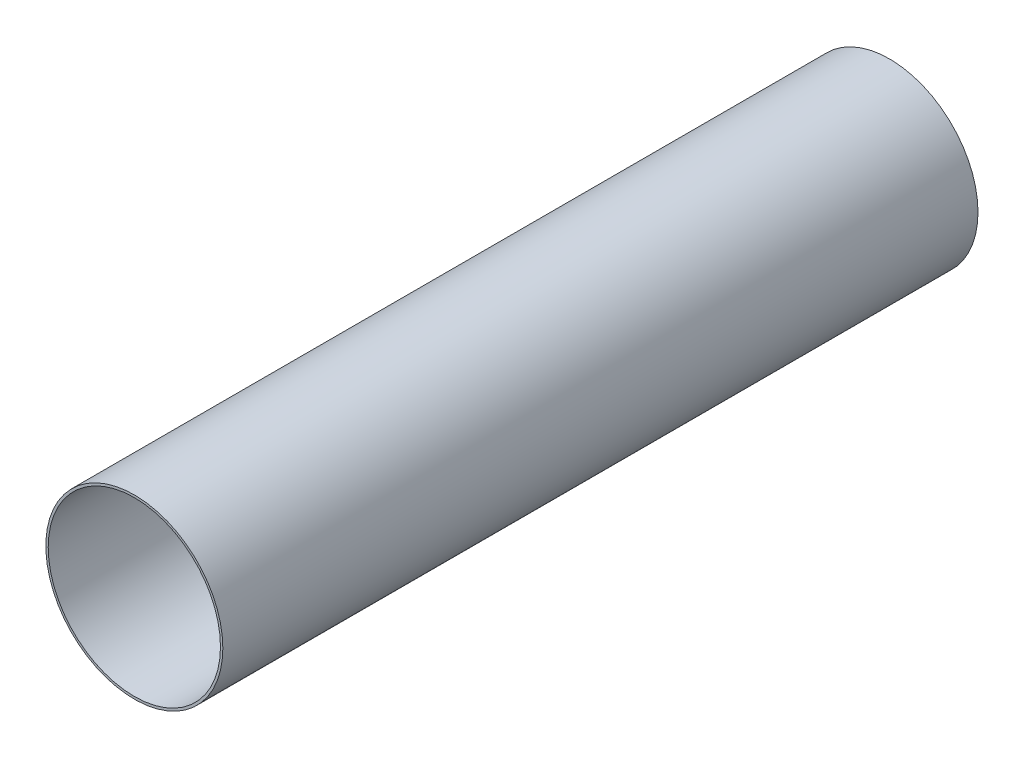
ISO-10303-21;
HEADER;
FILE_DESCRIPTION(('STEP AP214'),'2;1');
FILE_NAME('part.step','',(''),(''),'','','');
FILE_SCHEMA(('AUTOMOTIVE_DESIGN { 1 0 10303 214 1 1 1 1 }'));
ENDSEC;
DATA;
#1=APPLICATION_CONTEXT('core data for automotive mechanical design processes');
#2=APPLICATION_PROTOCOL_DEFINITION('international standard','automotive_design',2000,#1);
#3=PRODUCT_CONTEXT('',#1,'mechanical');
#4=PRODUCT('Part','Part','',(#3));
#5=PRODUCT_RELATED_PRODUCT_CATEGORY('part','',(#4));
#6=PRODUCT_DEFINITION_FORMATION('','',#4);
#7=PRODUCT_DEFINITION_CONTEXT('part definition',#1,'design');
#8=PRODUCT_DEFINITION('design','',#6,#7);
#9=PRODUCT_DEFINITION_SHAPE('','',#8);
#10=(LENGTH_UNIT() NAMED_UNIT(*) SI_UNIT(.MILLI.,.METRE.));
#11=(NAMED_UNIT(*) PLANE_ANGLE_UNIT() SI_UNIT($,.RADIAN.));
#12=(NAMED_UNIT(*) SI_UNIT($,.STERADIAN.) SOLID_ANGLE_UNIT());
#13=UNCERTAINTY_MEASURE_WITH_UNIT(LENGTH_MEASURE(1.E-05),#10,'distance_accuracy_value','');
#14=(GEOMETRIC_REPRESENTATION_CONTEXT(3) GLOBAL_UNCERTAINTY_ASSIGNED_CONTEXT((#13)) GLOBAL_UNIT_ASSIGNED_CONTEXT((#10,
#11,#12)) REPRESENTATION_CONTEXT('',''));
#15=CARTESIAN_POINT('',(0.,0.,0.));
#16=DIRECTION('',(0.,0.,1.));
#17=DIRECTION('',(1.,0.,0.));
#18=AXIS2_PLACEMENT_3D('',#15,#16,#17);
#19=CARTESIAN_POINT('',(0.,0.,640.));
#20=DIRECTION('',(0.,0.,1.));
#21=DIRECTION('',(1.,0.,0.));
#22=AXIS2_PLACEMENT_3D('',#19,#20,#21);
#23=PLANE('',#22);
#24=CARTESIAN_POINT('',(0.,0.,640.));
#25=DIRECTION('',(0.,0.,1.));
#26=DIRECTION('',(1.,0.,0.));
#27=AXIS2_PLACEMENT_3D('',#24,#25,#26);
#28=CIRCLE('',#27,75.);
#29=CARTESIAN_POINT('',(75.,0.,640.));
#30=VERTEX_POINT('',#29);
#31=EDGE_CURVE('E11',#30,#30,#28,.T.);
#32=ORIENTED_EDGE('',*,*,#31,.T.);
#33=EDGE_LOOP('',(#32));
#34=FACE_BOUND('',#33,.T.);
#35=CARTESIAN_POINT('',(0.,0.,640.));
#36=DIRECTION('',(0.,0.,1.));
#37=DIRECTION('',(1.,0.,0.));
#38=AXIS2_PLACEMENT_3D('',#35,#36,#37);
#39=CIRCLE('',#38,73.);
#40=CARTESIAN_POINT('',(73.,0.,640.));
#41=VERTEX_POINT('',#40);
#42=EDGE_CURVE('E49',#41,#41,#39,.T.);
#43=ORIENTED_EDGE('',*,*,#42,.F.);
#44=EDGE_LOOP('',(#43));
#45=FACE_BOUND('',#44,.T.);
#46=ADVANCED_FACE('F38',(#34,#45),#23,.T.);
#47=CARTESIAN_POINT('',(0.,0.,0.));
#48=DIRECTION('',(0.,0.,1.));
#49=DIRECTION('',(1.,0.,0.));
#50=AXIS2_PLACEMENT_3D('',#47,#48,#49);
#51=PLANE('',#50);
#52=CARTESIAN_POINT('',(0.,0.,0.));
#53=DIRECTION('',(0.,0.,1.));
#54=DIRECTION('',(1.,0.,0.));
#55=AXIS2_PLACEMENT_3D('',#52,#53,#54);
#56=CIRCLE('',#55,75.);
#57=CARTESIAN_POINT('',(75.,0.,0.));
#58=VERTEX_POINT('',#57);
#59=EDGE_CURVE('E42',#58,#58,#56,.T.);
#60=ORIENTED_EDGE('',*,*,#59,.F.);
#61=EDGE_LOOP('',(#60));
#62=FACE_BOUND('',#61,.T.);
#63=CARTESIAN_POINT('',(0.,0.,0.));
#64=DIRECTION('',(0.,0.,1.));
#65=DIRECTION('',(1.,0.,0.));
#66=AXIS2_PLACEMENT_3D('',#63,#64,#65);
#67=CIRCLE('',#66,73.);
#68=CARTESIAN_POINT('',(73.,0.,0.));
#69=VERTEX_POINT('',#68);
#70=EDGE_CURVE('E51',#69,#69,#67,.T.);
#71=ORIENTED_EDGE('',*,*,#70,.T.);
#72=EDGE_LOOP('',(#71));
#73=FACE_BOUND('',#72,.T.);
#74=ADVANCED_FACE('F61',(#62,#73),#51,.F.);
#75=CARTESIAN_POINT('',(0.,0.,640.));
#76=DIRECTION('',(0.,0.,-1.));
#77=DIRECTION('',(-1.,0.,0.));
#78=AXIS2_PLACEMENT_3D('',#75,#76,#77);
#79=CYLINDRICAL_SURFACE('',#78,75.);
#80=ORIENTED_EDGE('',*,*,#31,.F.);
#81=EDGE_LOOP('',(#80));
#82=FACE_BOUND('',#81,.T.);
#83=ORIENTED_EDGE('',*,*,#59,.T.);
#84=EDGE_LOOP('',(#83));
#85=FACE_BOUND('',#84,.T.);
#86=ADVANCED_FACE('F40',(#82,#85),#79,.T.);
#87=CARTESIAN_POINT('',(0.,0.,640.));
#88=DIRECTION('',(0.,0.,-1.));
#89=DIRECTION('',(-1.,0.,0.));
#90=AXIS2_PLACEMENT_3D('',#87,#88,#89);
#91=CYLINDRICAL_SURFACE('',#90,73.);
#92=ORIENTED_EDGE('',*,*,#42,.T.);
#93=EDGE_LOOP('',(#92));
#94=FACE_BOUND('',#93,.T.);
#95=ORIENTED_EDGE('',*,*,#70,.F.);
#96=EDGE_LOOP('',(#95));
#97=FACE_BOUND('',#96,.T.);
#98=ADVANCED_FACE('F57',(#94,#97),#91,.F.);
#99=CLOSED_SHELL('',(#46,#74,#86,#98));
#100=MANIFOLD_SOLID_BREP('B2',#99);
#101=ADVANCED_BREP_SHAPE_REPRESENTATION('',(#18,#100),#14);
#102=SHAPE_DEFINITION_REPRESENTATION(#9,#101);
ENDSEC;
END-ISO-10303-21;
